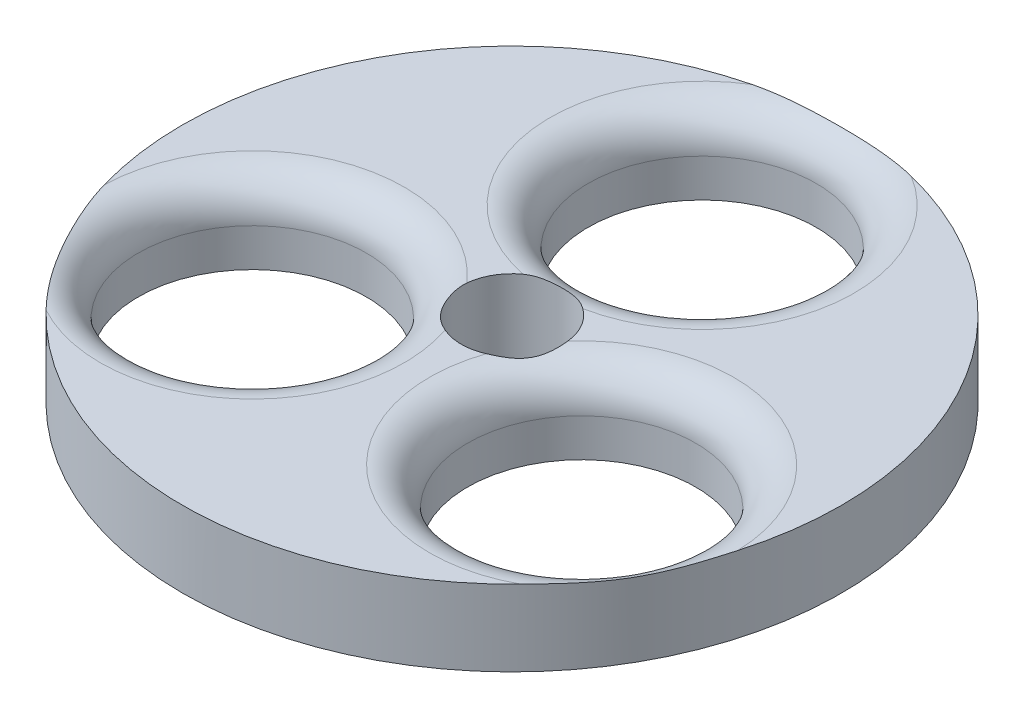
ISO-10303-21;
HEADER;
FILE_DESCRIPTION(('STEP AP214'),'2;1');
FILE_NAME('part.step','',(''),(''),'','','');
FILE_SCHEMA(('AUTOMOTIVE_DESIGN { 1 0 10303 214 1 1 1 1 }'));
ENDSEC;
DATA;
#1=APPLICATION_CONTEXT('core data for automotive mechanical design processes');
#2=APPLICATION_PROTOCOL_DEFINITION('international standard','automotive_design',2000,#1);
#3=PRODUCT_CONTEXT('',#1,'mechanical');
#4=PRODUCT('Part','Part','',(#3));
#5=PRODUCT_RELATED_PRODUCT_CATEGORY('part','',(#4));
#6=PRODUCT_DEFINITION_FORMATION('','',#4);
#7=PRODUCT_DEFINITION_CONTEXT('part definition',#1,'design');
#8=PRODUCT_DEFINITION('design','',#6,#7);
#9=PRODUCT_DEFINITION_SHAPE('','',#8);
#10=(LENGTH_UNIT() NAMED_UNIT(*) SI_UNIT(.MILLI.,.METRE.));
#11=(NAMED_UNIT(*) PLANE_ANGLE_UNIT() SI_UNIT($,.RADIAN.));
#12=(NAMED_UNIT(*) SI_UNIT($,.STERADIAN.) SOLID_ANGLE_UNIT());
#13=UNCERTAINTY_MEASURE_WITH_UNIT(LENGTH_MEASURE(1.E-05),#10,'distance_accuracy_value','');
#14=(GEOMETRIC_REPRESENTATION_CONTEXT(3) GLOBAL_UNCERTAINTY_ASSIGNED_CONTEXT((#13)) GLOBAL_UNIT_ASSIGNED_CONTEXT((#10,
#11,#12)) REPRESENTATION_CONTEXT('',''));
#15=CARTESIAN_POINT('',(0.,0.,0.));
#16=DIRECTION('',(0.,0.,1.));
#17=DIRECTION('',(1.,0.,0.));
#18=AXIS2_PLACEMENT_3D('',#15,#16,#17);
#19=CARTESIAN_POINT('',(2.23477578617358E-13,31.8657650719965,0.));
#20=DIRECTION('',(0.,1.,0.));
#21=DIRECTION('',(0.,0.,1.));
#22=AXIS2_PLACEMENT_3D('',#19,#20,#21);
#23=PLANE('',#22);
#24=CARTESIAN_POINT('',(2.23477578617358E-13,31.8657650719965,0.));
#25=DIRECTION('',(0.,1.,0.));
#26=DIRECTION('',(0.,0.,1.));
#27=AXIS2_PLACEMENT_3D('',#24,#25,#26);
#28=CIRCLE('',#27,145.6);
#29=CARTESIAN_POINT('',(-104.826758888139,31.8657650719965,101.048060946304));
#30=VERTEX_POINT('',#29);
#31=CARTESIAN_POINT('',(104.82675888814,31.8657650719965,101.048060946303));
#32=VERTEX_POINT('',#31);
#33=EDGE_CURVE('E107',#30,#32,#28,.T.);
#34=ORIENTED_EDGE('',*,*,#33,.T.);
#35=CARTESIAN_POINT('',(72.7461339178978,31.8657650719965,41.9999999999973));
#36=DIRECTION('',(0.,1.,0.));
#37=DIRECTION('',(0.,0.,1.));
#38=AXIS2_PLACEMENT_3D('',#35,#36,#37);
#39=CIRCLE('',#38,67.2);
#40=CARTESIAN_POINT('',(9.08711239235438,31.8657650719965,20.4739929756929));
#41=VERTEX_POINT('',#40);
#42=EDGE_CURVE('E95',#32,#41,#39,.F.);
#43=ORIENTED_EDGE('',*,*,#42,.T.);
#44=CARTESIAN_POINT('',(2.23477578617358E-13,31.8657650719965,0.));
#45=DIRECTION('',(0.,1.,0.));
#46=DIRECTION('',(0.,0.,1.));
#47=AXIS2_PLACEMENT_3D('',#44,#45,#46);
#48=CIRCLE('',#47,22.4);
#49=CARTESIAN_POINT('',(-9.08711239234495,31.8657650719965,20.4739929756969));
#50=VERTEX_POINT('',#49);
#51=EDGE_CURVE('E106',#50,#41,#48,.T.);
#52=ORIENTED_EDGE('',*,*,#51,.F.);
#53=CARTESIAN_POINT('',(-72.7461339178879,31.8657650719965,42.0000000000028));
#54=DIRECTION('',(0.,1.,0.));
#55=DIRECTION('',(0.,0.,1.));
#56=AXIS2_PLACEMENT_3D('',#53,#54,#55);
#57=CIRCLE('',#56,67.2);
#58=EDGE_CURVE('E136',#50,#30,#57,.F.);
#59=ORIENTED_EDGE('',*,*,#58,.T.);
#60=EDGE_LOOP('',(#34,#43,#52,#59));
#61=FACE_BOUND('',#60,.T.);
#62=ADVANCED_FACE('F35',(#61),#23,.T.);
#63=CARTESIAN_POINT('',(22.2745542300313,31.8657650719965,-2.36732630902591));
#64=VERTEX_POINT('',#63);
#65=CARTESIAN_POINT('',(13.1874418376814,31.8657650719965,-18.1066666666666));
#66=VERTEX_POINT('',#65);
#67=EDGE_CURVE('E117',#64,#66,#48,.T.);
#68=ORIENTED_EDGE('',*,*,#67,.F.);
#69=CARTESIAN_POINT('',(72.7461339178978,31.8657650719965,41.9999999999973));
#70=DIRECTION('',(0.,1.,0.));
#71=DIRECTION('',(0.,0.,1.));
#72=AXIS2_PLACEMENT_3D('',#69,#70,#71);
#73=CIRCLE('',#72,67.2);
#74=CARTESIAN_POINT('',(139.923567226732,31.8657650719965,40.2586057203474));
#75=VERTEX_POINT('',#74);
#76=EDGE_CURVE('E96',#64,#75,#73,.F.);
#77=ORIENTED_EDGE('',*,*,#76,.T.);
#78=CARTESIAN_POINT('',(35.096808338588,31.8657650719965,-141.306666666667));
#79=VERTEX_POINT('',#78);
#80=EDGE_CURVE('E129',#75,#79,#28,.T.);
#81=ORIENTED_EDGE('',*,*,#80,.T.);
#82=CARTESIAN_POINT('',(2.23477578617358E-13,31.8657650719965,-84.));
#83=DIRECTION('',(0.,1.,0.));
#84=DIRECTION('',(0.,0.,1.));
#85=AXIS2_PLACEMENT_3D('',#82,#83,#84);
#86=CIRCLE('',#85,67.2);
#87=EDGE_CURVE('E140',#79,#66,#86,.F.);
#88=ORIENTED_EDGE('',*,*,#87,.T.);
#89=EDGE_LOOP('',(#68,#77,#81,#88));
#90=FACE_BOUND('',#89,.T.);
#91=ADVANCED_FACE('F206',(#90),#23,.T.);
#92=CARTESIAN_POINT('',(-13.1874418376809,31.8657650719965,-18.1066666666666));
#93=VERTEX_POINT('',#92);
#94=CARTESIAN_POINT('',(-22.2745542300303,31.8657650719965,-2.36732630903062));
#95=VERTEX_POINT('',#94);
#96=EDGE_CURVE('E114',#93,#95,#48,.T.);
#97=ORIENTED_EDGE('',*,*,#96,.F.);
#98=CARTESIAN_POINT('',(2.23477578617358E-13,31.8657650719965,-84.));
#99=DIRECTION('',(0.,1.,0.));
#100=DIRECTION('',(0.,0.,1.));
#101=AXIS2_PLACEMENT_3D('',#98,#99,#100);
#102=CIRCLE('',#101,67.2);
#103=CARTESIAN_POINT('',(-35.0968083385875,31.8657650719965,-141.306666666667));
#104=VERTEX_POINT('',#103);
#105=EDGE_CURVE('E138',#93,#104,#102,.F.);
#106=ORIENTED_EDGE('',*,*,#105,.T.);
#107=CARTESIAN_POINT('',(-139.923567226722,31.8657650719965,40.2586057203783));
#108=VERTEX_POINT('',#107);
#109=EDGE_CURVE('E127',#104,#108,#28,.T.);
#110=ORIENTED_EDGE('',*,*,#109,.T.);
#111=CARTESIAN_POINT('',(-72.7461339178879,31.8657650719965,42.0000000000028));
#112=DIRECTION('',(0.,1.,0.));
#113=DIRECTION('',(0.,0.,1.));
#114=AXIS2_PLACEMENT_3D('',#111,#112,#113);
#115=CIRCLE('',#114,67.2);
#116=EDGE_CURVE('E134',#108,#95,#115,.F.);
#117=ORIENTED_EDGE('',*,*,#116,.T.);
#118=EDGE_LOOP('',(#97,#106,#110,#117));
#119=FACE_BOUND('',#118,.T.);
#120=ADVANCED_FACE('F161',(#119),#23,.T.);
#121=CARTESIAN_POINT('',(2.23477578617358E-13,-1.73423492800355,0.));
#122=DIRECTION('',(0.,1.,0.));
#123=DIRECTION('',(0.,0.,1.));
#124=AXIS2_PLACEMENT_3D('',#121,#122,#123);
#125=PLANE('',#124);
#126=CARTESIAN_POINT('',(2.23477578617358E-13,-1.73423492800355,0.));
#127=DIRECTION('',(0.,1.,0.));
#128=DIRECTION('',(0.,0.,1.));
#129=AXIS2_PLACEMENT_3D('',#126,#127,#128);
#130=CIRCLE('',#129,145.6);
#131=CARTESIAN_POINT('',(2.23477578617358E-13,-1.73423492800355,145.6));
#132=VERTEX_POINT('',#131);
#133=EDGE_CURVE('E122',#132,#132,#130,.T.);
#134=ORIENTED_EDGE('',*,*,#133,.F.);
#135=EDGE_LOOP('',(#134));
#136=FACE_BOUND('',#135,.T.);
#137=CARTESIAN_POINT('',(2.23477578617358E-13,-1.73423492800355,0.));
#138=DIRECTION('',(0.,1.,0.));
#139=DIRECTION('',(0.,0.,1.));
#140=AXIS2_PLACEMENT_3D('',#137,#138,#139);
#141=CIRCLE('',#140,22.4);
#142=CARTESIAN_POINT('',(2.23477578617358E-13,-1.73423492800355,22.4));
#143=VERTEX_POINT('',#142);
#144=EDGE_CURVE('E115',#143,#143,#141,.T.);
#145=ORIENTED_EDGE('',*,*,#144,.T.);
#146=EDGE_LOOP('',(#145));
#147=FACE_BOUND('',#146,.T.);
#148=CARTESIAN_POINT('',(2.23477578617358E-13,-1.73423492800355,-84.));
#149=DIRECTION('',(0.,1.,0.));
#150=DIRECTION('',(0.,0.,1.));
#151=AXIS2_PLACEMENT_3D('',#148,#149,#150);
#152=CIRCLE('',#151,50.4);
#153=CARTESIAN_POINT('',(2.23477578617358E-13,-1.73423492800355,-33.6));
#154=VERTEX_POINT('',#153);
#155=EDGE_CURVE('E119',#154,#154,#152,.T.);
#156=ORIENTED_EDGE('',*,*,#155,.T.);
#157=EDGE_LOOP('',(#156));
#158=FACE_BOUND('',#157,.T.);
#159=CARTESIAN_POINT('',(72.7461339178978,-1.73423492800355,41.9999999999973));
#160=DIRECTION('',(0.,1.,0.));
#161=DIRECTION('',(0.,0.,1.));
#162=AXIS2_PLACEMENT_3D('',#159,#160,#161);
#163=CIRCLE('',#162,50.4);
#164=CARTESIAN_POINT('',(72.7461339178978,-1.73423492800355,92.3999999999973));
#165=VERTEX_POINT('',#164);
#166=EDGE_CURVE('E235',#165,#165,#163,.T.);
#167=ORIENTED_EDGE('',*,*,#166,.T.);
#168=EDGE_LOOP('',(#167));
#169=FACE_BOUND('',#168,.T.);
#170=CARTESIAN_POINT('',(-72.7461339178879,-1.73423492800355,42.0000000000028));
#171=DIRECTION('',(0.,1.,0.));
#172=DIRECTION('',(0.,0.,1.));
#173=AXIS2_PLACEMENT_3D('',#170,#171,#172);
#174=CIRCLE('',#173,50.4);
#175=CARTESIAN_POINT('',(-72.7461339178879,-1.73423492800355,92.4000000000028));
#176=VERTEX_POINT('',#175);
#177=EDGE_CURVE('E233',#176,#176,#174,.T.);
#178=ORIENTED_EDGE('',*,*,#177,.T.);
#179=EDGE_LOOP('',(#178));
#180=FACE_BOUND('',#179,.T.);
#181=ADVANCED_FACE('F212',(#136,#147,#158,#169,#180),#125,.F.);
#182=CARTESIAN_POINT('',(2.23477578617358E-13,31.8657650719965,0.));
#183=DIRECTION('',(0.,-1.,0.));
#184=DIRECTION('',(0.,0.,-1.));
#185=AXIS2_PLACEMENT_3D('',#182,#183,#184);
#186=CYLINDRICAL_SURFACE('',#185,145.6);
#187=ORIENTED_EDGE('',*,*,#80,.F.);
#188=CARTESIAN_POINT('',(139.923567226732,31.8657650719965,40.2586057203474));
#189=CARTESIAN_POINT('',(139.726695505825,31.8657601859447,40.9428583914413));
#190=CARTESIAN_POINT('',(139.52481043307,31.8616562214105,41.6256431473033));
#191=CARTESIAN_POINT('',(139.111076116014,31.8464291109142,42.9880834401035));
#192=CARTESIAN_POINT('',(138.899227233044,31.8353062193078,43.6677390895371));
#193=CARTESIAN_POINT('',(138.248887676413,31.7931822231437,45.7015433460936));
#194=CARTESIAN_POINT('',(137.795530535242,31.7534249146378,47.0507849078582));
#195=CARTESIAN_POINT('',(136.849455165038,31.659533100797,49.7354322419516));
#196=CARTESIAN_POINT('',(136.356721266702,31.6053928518993,51.0708322650786));
#197=CARTESIAN_POINT('',(135.332383501371,31.4912359687793,53.7264499054257));
#198=CARTESIAN_POINT('',(134.800777958949,31.4312190812273,55.0466668653915));
#199=CARTESIAN_POINT('',(133.707318929033,31.3140531265344,57.6513471427394));
#200=CARTESIAN_POINT('',(133.146038581411,31.2568745502908,58.936049731815));
#201=CARTESIAN_POINT('',(131.986479474581,31.1510690638781,61.4889803461969));
#202=CARTESIAN_POINT('',(131.388201471384,31.1024419790452,62.7572087074985));
#203=CARTESIAN_POINT('',(130.155270632683,31.0191732762235,65.2758034421895));
#204=CARTESIAN_POINT('',(129.520631032171,30.9845266060743,66.5261761103159));
#205=CARTESIAN_POINT('',(128.541680034918,30.9458247189867,68.3877777355784));
#206=CARTESIAN_POINT('',(128.210856458572,30.9351353490336,69.0059995435565));
#207=CARTESIAN_POINT('',(127.540286644548,30.9184470183222,70.2376459180874));
#208=CARTESIAN_POINT('',(127.200540516285,30.9124480000749,70.8510705433472));
#209=CARTESIAN_POINT('',(126.481216185113,30.9049910504233,72.1279849332048));
#210=CARTESIAN_POINT('',(126.100806089659,30.9039906856191,72.7910088482497));
#211=CARTESIAN_POINT('',(125.329597719712,30.9077993533471,74.1109722148275));
#212=CARTESIAN_POINT('',(124.938799418886,30.9126084006063,74.7679116509318));
#213=CARTESIAN_POINT('',(124.146933137204,30.927880063474,76.0755099391277));
#214=CARTESIAN_POINT('',(123.745865097307,30.9383427115916,76.7261687550826));
#215=CARTESIAN_POINT('',(122.933583040057,30.9645809368847,78.0210117253559));
#216=CARTESIAN_POINT('',(122.522369027075,30.9803565117713,78.6651958824634));
#217=CARTESIAN_POINT('',(121.689716465727,31.0167168222463,79.9472163032733));
#218=CARTESIAN_POINT('',(121.268273204262,31.0373038138773,80.585049442294));
#219=CARTESIAN_POINT('',(120.415460718699,31.0826015905468,81.8539014194271));
#220=CARTESIAN_POINT('',(119.984091335919,31.1073124415495,82.4849201483659));
#221=CARTESIAN_POINT('',(118.675252983152,31.1864402212362,84.3675336799653));
#222=CARTESIAN_POINT('',(117.783036152609,31.24585321209,85.6087130109993));
#223=CARTESIAN_POINT('',(115.945052612754,31.3710915755441,88.0824530552424));
#224=CARTESIAN_POINT('',(114.99864411835,31.4370067839661,89.3145313440252));
#225=CARTESIAN_POINT('',(113.066780928266,31.5645056922724,91.747894074205));
#226=CARTESIAN_POINT('',(112.08132803443,31.626089591677,92.9491799324244));
#227=CARTESIAN_POINT('',(110.574767644992,31.7070237154793,94.7268899558167));
#228=CARTESIAN_POINT('',(110.068000520052,31.7320892362389,95.3152577409454));
#229=CARTESIAN_POINT('',(109.045016108565,31.7769782942471,96.4839235500814));
#230=CARTESIAN_POINT('',(108.528798937054,31.7968018952608,97.0642216721707));
#231=CARTESIAN_POINT('',(107.486951540798,31.8297455414591,98.2166927703376));
#232=CARTESIAN_POINT('',(106.961319656504,31.8428643925058,98.7888642814093));
#233=CARTESIAN_POINT('',(105.900876443719,31.8608702103693,99.9248128306613));
#234=CARTESIAN_POINT('',(105.366064701519,31.8657568051943,100.488589488362));
#235=CARTESIAN_POINT('',(104.82675888814,31.8657650719965,101.048060946303));
#236=B_SPLINE_CURVE_WITH_KNOTS('',3,(#188,#189,#190,#191,#192,#193,#194,#195,#196,#197,#198,
#199,#200,#201,#202,#203,#204,#205,#206,#207,#208,#209,#210,#211,#212,#213,#214,#215,#216,#217,
#218,#219,#220,#221,#222,#223,#224,#225,#226,#227,#228,#229,#230,#231,#232,#233,#234,#235),
.UNSPECIFIED.,.F.,.F.,(4,2,2,2,2,2,2,2,2,2,2,2,2,2,2,2,2,2,2,2,2,2,2,4),(0.,2.13596160512915,
4.27184581053873,8.54281658862121,12.8154954707875,17.0883586204998,21.2971464485245,
25.5058483022956,29.7130278749878,31.8167151477063,33.9203766354711,36.2134712220517,
38.5065716217107,40.7996852072851,43.0927978049595,45.3869877933668,47.6812144826078,
52.2695706332284,56.9338478453245,61.5979100578937,63.9286007249599,66.2592630390314,
68.5903403071286,70.9215229070047),.UNSPECIFIED.);
#237=EDGE_CURVE('E185',#75,#32,#236,.T.);
#238=ORIENTED_EDGE('',*,*,#237,.T.);
#239=ORIENTED_EDGE('',*,*,#33,.F.);
#240=CARTESIAN_POINT('',(-104.826758888139,31.8657650719965,101.048060946304));
#241=CARTESIAN_POINT('',(-105.32090322346,31.8657601859447,100.535438699165));
#242=CARTESIAN_POINT('',(-105.811269630976,31.8616562214105,100.019208719584));
#243=CARTESIAN_POINT('',(-106.784310377152,31.8464291109142,98.9796841441952));
#244=CARTESIAN_POINT('',(-107.266984993902,31.8353062193079,98.4563898050628));
#245=CARTESIAN_POINT('',(-108.703141368089,31.7931822231438,96.8762770996563));
#246=CARTESIAN_POINT('',(-109.644940265834,31.7534249146379,95.8090375175331));
#247=CARTESIAN_POINT('',(-111.496875372259,31.6595331007972,93.6473885459949));
#248=CARTESIAN_POINT('',(-112.406998767333,31.6053928518996,92.5529684611665));
#249=CARTESIAN_POINT('',(-114.194662223945,31.4912359687798,90.3380571141598));
#250=CARTESIAN_POINT('',(-115.072200878572,31.4312190812279,89.2175647296469));
#251=CARTESIAN_POINT('',(-116.781190652533,31.3140531265352,86.9682612930678));
#252=CARTESIAN_POINT('',(-117.613135557169,31.2568745502917,85.839826958845));
#253=CARTESIAN_POINT('',(-119.244258769908,31.1510690638792,83.5591540079491));
#254=CARTESIAN_POINT('',(-120.043437746996,31.1024419790464,82.4069158780044));
#255=CARTESIAN_POINT('',(-121.608139349726,31.0191732762249,80.0798690832344));
#256=CARTESIAN_POINT('',(-122.373674044265,30.9845266060758,78.9050687328797));
#257=CARTESIAN_POINT('',(-123.496392844842,30.9458247189884,77.1264714875673));
#258=CARTESIAN_POINT('',(-123.866376847551,30.9351353490353,76.5308589622922));
#259=CARTESIAN_POINT('',(-124.597728989362,30.9184470183239,75.3343052810708));
#260=CARTESIAN_POINT('',(-124.959097234012,30.9124480000767,74.7333641905271));
#261=CARTESIAN_POINT('',(-125.7052753685,30.9049910504252,73.4719538512439));
#262=CARTESIAN_POINT('',(-126.089265874519,30.903990685621,72.8109970872031));
#263=CARTESIAN_POINT('',(-126.846783497065,30.9077993533491,71.4831293639295));
#264=CARTESIAN_POINT('',(-127.220310587066,30.9126084006084,70.8162183896068));
#265=CARTESIAN_POINT('',(-127.956790781747,30.927880063476,69.4766429291729));
#266=CARTESIAN_POINT('',(-128.319743825612,30.9383427115937,68.8039784099995));
#267=CARTESIAN_POINT('',(-129.034969703154,30.9645809368868,67.4531000282473));
#268=CARTESIAN_POINT('',(-129.387242541434,30.9803565117733,66.7748861680594));
#269=CARTESIAN_POINT('',(-130.08117851335,31.0167168222483,65.4127776870014));
#270=CARTESIAN_POINT('',(-130.422836584385,31.0373038138793,64.7288805468097));
#271=CARTESIAN_POINT('',(-131.095288387442,31.0826015905487,63.3558972810818));
#272=CARTESIAN_POINT('',(-131.426081945577,31.1073124415513,62.6668110727108));
#273=CARTESIAN_POINT('',(-132.402053913066,31.1864402212379,60.592017043969));
#274=CARTESIAN_POINT('',(-133.030838329122,31.2458532120916,59.198744937519));
#275=CARTESIAN_POINT('',(-134.254168279866,31.3710915755453,56.3701344781478));
#276=CARTESIAN_POINT('',(-134.847975130201,31.4370067839672,54.934481535246));
#277=CARTESIAN_POINT('',(-135.989397476116,31.5645056922731,52.0447575709102));
#278=CARTESIAN_POINT('',(-136.537015099623,31.6260895916777,50.5906874015066));
#279=CARTESIAN_POINT('',(-137.323276945723,31.7070237154797,48.397112820224));
#280=CARTESIAN_POINT('',(-137.579434831943,31.7320892362393,47.6640557236597));
#281=CARTESIAN_POINT('',(-138.080036905445,31.7769782942473,46.1937923310693));
#282=CARTESIAN_POINT('',(-138.324481235187,31.796801895261,45.4565860856271));
#283=CARTESIAN_POINT('',(-138.801626785199,31.8297455414592,43.9780842245204));
#284=CARTESIAN_POINT('',(-139.034325906961,31.8428643925059,43.2367879041478));
#285=CARTESIAN_POINT('',(-139.487864601613,31.8608702103693,41.7504428679802));
#286=CARTESIAN_POINT('',(-139.708703638142,31.8657568051943,41.0053939841433));
#287=CARTESIAN_POINT('',(-139.923567226722,31.8657650719965,40.2586057203783));
#288=B_SPLINE_CURVE_WITH_KNOTS('',3,(#240,#241,#242,#243,#244,#245,#246,#247,#248,#249,#250,
#251,#252,#253,#254,#255,#256,#257,#258,#259,#260,#261,#262,#263,#264,#265,#266,#267,#268,#269,
#270,#271,#272,#273,#274,#275,#276,#277,#278,#279,#280,#281,#282,#283,#284,#285,#286,#287),
.UNSPECIFIED.,.F.,.F.,(4,2,2,2,2,2,2,2,2,2,2,2,2,2,2,2,2,2,2,2,2,2,2,4),(0.,2.13596160512916,
4.27184581053872,8.54281658862116,12.8154954707874,17.0883586204997,21.2971464485245,
25.5058483022955,29.7130278749877,31.8167151477062,33.9203766354711,36.2134712220497,
38.5065716217069,40.7996852072793,43.0927978049518,45.3869877933572,47.6812144825963,
52.269570633213,56.9338478453051,61.5979100578703,63.9286007249345,66.2592630390041,
68.5903403070993,70.9215229069734),.UNSPECIFIED.);
#289=EDGE_CURVE('E51',#30,#108,#288,.T.);
#290=ORIENTED_EDGE('',*,*,#289,.T.);
#291=ORIENTED_EDGE('',*,*,#109,.F.);
#292=CARTESIAN_POINT('',(-35.0968083385875,31.8657650719965,-141.306666666667));
#293=CARTESIAN_POINT('',(-34.4057922823595,31.8657601859447,-141.478297090622));
#294=CARTESIAN_POINT('',(-33.7135408020889,31.8616562214105,-141.644851866902));
#295=CARTESIAN_POINT('',(-32.3267657388562,31.8464291109142,-141.967767584314));
#296=CARTESIAN_POINT('',(-31.6322422391359,31.8353062193078,-142.124128894615));
#297=CARTESIAN_POINT('',(-29.5457463083177,31.7931822231438,-142.577820445765));
#298=CARTESIAN_POINT('',(-28.1505902694024,31.7534249146378,-142.859822425406));
#299=CARTESIAN_POINT('',(-25.3525797927734,31.6595331007971,-143.382820787961));
#300=CARTESIAN_POINT('',(-23.949722499363,31.6053928518994,-143.62380072626));
#301=CARTESIAN_POINT('',(-21.1377212774184,31.4912359687796,-144.0645070196));
#302=CARTESIAN_POINT('',(-19.7285770803701,31.4312190812276,-144.264231595053));
#303=CARTESIAN_POINT('',(-16.9261282764923,31.3140531265348,-144.619608435822));
#304=CARTESIAN_POINT('',(-15.5329030242347,31.2568745502913,-144.775876690674));
#305=CARTESIAN_POINT('',(-12.7422207046656,31.1510690638786,-145.04813435416));
#306=CARTESIAN_POINT('',(-11.3447637243802,31.1024419790458,-145.164124585517));
#307=CARTESIAN_POINT('',(-8.54713128294949,31.0191732762242,-145.355672525438));
#308=CARTESIAN_POINT('',(-7.14695698789802,30.984526606075,-145.43124484321));
#309=CARTESIAN_POINT('',(-5.04528719006788,30.9458247189875,-145.514249223159));
#310=CARTESIAN_POINT('',(-4.34447961101261,30.9351353490345,-145.536858505862));
#311=CARTESIAN_POINT('',(-2.94255765517781,30.9184470183231,-145.571951199172));
#312=CARTESIAN_POINT('',(-2.24144328226398,30.9124480000758,-145.584434733888));
#313=CARTESIAN_POINT('',(-0.77594081660388,30.9049910504243,-145.599938784462));
#314=CARTESIAN_POINT('',(-0.0115402151319072,30.9039906856201,-145.602005935465));
#315=CARTESIAN_POINT('',(1.5171857773624,30.9077993533481,-145.594101578768));
#316=CARTESIAN_POINT('',(2.28151116818916,30.9126084006074,-145.584130040549));
#317=CARTESIAN_POINT('',(3.80985764455228,30.927880063475,-145.55215286831));
#318=CARTESIAN_POINT('',(4.57387872831355,30.9383427115927,-145.530147165091));
#319=CARTESIAN_POINT('',(6.10138666310614,30.9645809368858,-145.474111753611));
#320=CARTESIAN_POINT('',(6.86487351436749,30.9803565117723,-145.44008205053));
#321=CARTESIAN_POINT('',(8.39146204763302,31.0167168222473,-145.35999399028));
#322=CARTESIAN_POINT('',(9.15456338013238,31.0373038138783,-145.313929989109));
#323=CARTESIAN_POINT('',(10.6798276687528,31.0826015905477,-145.209798700513));
#324=CARTESIAN_POINT('',(11.4419906096672,31.1073124415504,-145.15173122108));
#325=CARTESIAN_POINT('',(13.7268009299232,31.186440221237,-144.959550723936));
#326=CARTESIAN_POINT('',(15.2478021765217,31.2458532120908,-144.807457948519));
#327=CARTESIAN_POINT('',(18.3091156671212,31.3710915755447,-144.452587533388));
#328=CARTESIAN_POINT('',(19.8493310118599,31.4370067839667,-144.249012879268));
#329=CARTESIAN_POINT('',(22.9226165478583,31.5645056922728,-143.79265164511));
#330=CARTESIAN_POINT('',(24.4556870652009,31.6260895916774,-143.539867333924));
#331=CARTESIAN_POINT('',(26.7485093007387,31.7070237154795,-143.124002776032));
#332=CARTESIAN_POINT('',(27.5114343118981,31.7320892362391,-142.979313464596));
#333=CARTESIAN_POINT('',(29.0350207968872,31.7769782942472,-142.67771588114));
#334=CARTESIAN_POINT('',(29.79568229814,31.7968018952609,-142.520807757787));
#335=CARTESIAN_POINT('',(31.3146752444074,31.8297455414592,-142.194776994846));
#336=CARTESIAN_POINT('',(32.0730062504637,31.8428643925059,-142.025652185544));
#337=CARTESIAN_POINT('',(33.5869881579001,31.8608702103693,-141.675255698628));
#338=CARTESIAN_POINT('',(34.342638936629,31.8657568051943,-141.49398347249));
#339=CARTESIAN_POINT('',(35.096808338588,31.8657650719965,-141.306666666667));
#340=B_SPLINE_CURVE_WITH_KNOTS('',3,(#292,#293,#294,#295,#296,#297,#298,#299,#300,#301,#302,
#303,#304,#305,#306,#307,#308,#309,#310,#311,#312,#313,#314,#315,#316,#317,#318,#319,#320,#321,
#322,#323,#324,#325,#326,#327,#328,#329,#330,#331,#332,#333,#334,#335,#336,#337,#338,#339),
.UNSPECIFIED.,.F.,.F.,(4,2,2,2,2,2,2,2,2,2,2,2,2,2,2,2,2,2,2,2,2,2,2,4),(0.,2.13596160512915,
4.27184581053872,8.54281658862119,12.8154954707875,17.0883586204997,21.2971464485245,
25.5058483022955,29.7130278749878,31.8167151477062,33.9203766354711,36.2134712220507,
38.5065716217088,40.7996852072822,43.0927978049557,45.386987793362,47.6812144826021,
52.2695706332207,56.9338478453149,61.5979100578821,63.9286007249473,66.2592630390178,
68.5903403071141,70.9215229069891),.UNSPECIFIED.);
#341=EDGE_CURVE('E190',#104,#79,#340,.T.);
#342=ORIENTED_EDGE('',*,*,#341,.T.);
#343=EDGE_LOOP('',(#187,#238,#239,#290,#291,#342));
#344=FACE_BOUND('',#343,.T.);
#345=ORIENTED_EDGE('',*,*,#133,.T.);
#346=EDGE_LOOP('',(#345));
#347=FACE_BOUND('',#346,.T.);
#348=ADVANCED_FACE('F159',(#344,#347),#186,.T.);
#349=CARTESIAN_POINT('',(2.23477578617358E-13,31.8657650719965,0.));
#350=DIRECTION('',(0.,-1.,0.));
#351=DIRECTION('',(0.,0.,-1.));
#352=AXIS2_PLACEMENT_3D('',#349,#350,#351);
#353=CYLINDRICAL_SURFACE('',#352,22.4);
#354=ORIENTED_EDGE('',*,*,#51,.T.);
#355=CARTESIAN_POINT('',(9.08711239235438,31.8657650719965,20.4739929756929));
#356=CARTESIAN_POINT('',(9.41621093669795,31.8657716118947,20.3279416072496));
#357=CARTESIAN_POINT('',(9.74170829624843,31.8594969254864,20.1739621432215));
#358=CARTESIAN_POINT('',(10.3845010113663,31.8364976557753,19.8507264758442));
#359=CARTESIAN_POINT('',(10.7017995285294,31.8197771650964,19.6814762777161));
#360=CARTESIAN_POINT('',(11.3270935608473,31.778019616361,19.3283669587393));
#361=CARTESIAN_POINT('',(11.635099373914,31.7529921630728,19.1445248953802));
#362=CARTESIAN_POINT('',(12.2415303198177,31.6967253868685,18.7625529988077));
#363=CARTESIAN_POINT('',(12.5399544885276,31.6654854410981,18.564421734253));
#364=CARTESIAN_POINT('',(13.421323834378,31.5654378912301,17.9483303262399));
#365=CARTESIAN_POINT('',(13.9890881081722,31.490404614977,17.5093948560165));
#366=CARTESIAN_POINT('',(15.0799062168242,31.3400783323187,16.5792186241223));
#367=CARTESIAN_POINT('',(15.6029551597803,31.2647852984308,16.0879721527441));
#368=CARTESIAN_POINT('',(16.5232523253366,31.1391870834935,15.1363650090299));
#369=CARTESIAN_POINT('',(16.9274381320312,31.0868179161159,14.6830034359074));
#370=CARTESIAN_POINT('',(17.5055366818257,31.0213912994684,13.9788584079995));
#371=CARTESIAN_POINT('',(17.6935368473353,31.0017704825366,13.7401301197391));
#372=CARTESIAN_POINT('',(18.0598463383313,30.9675654332502,13.2549729691289));
#373=CARTESIAN_POINT('',(18.2381556157671,30.9529812258667,13.0085440686067));
#374=CARTESIAN_POINT('',(18.584137069806,30.9294181991681,12.5092685789207));
#375=CARTESIAN_POINT('',(18.7518422083843,30.9204211565492,12.2564456829857));
#376=CARTESIAN_POINT('',(19.0769050081281,30.9082767827968,11.7440935615657));
#377=CARTESIAN_POINT('',(19.2342626868977,30.9051294417112,11.4845643474911));
#378=CARTESIAN_POINT('',(19.5383062337709,30.9047983244864,10.9593189905607));
#379=CARTESIAN_POINT('',(19.6849919222224,30.9076146487158,10.6936027436517));
#380=CARTESIAN_POINT('',(19.9673957583734,30.9191092199768,10.1565327769569));
#381=CARTESIAN_POINT('',(20.1031139713611,30.9277874321104,9.88517909074236));
#382=CARTESIAN_POINT('',(20.3582344286968,30.9502477317361,9.34811047136148));
#383=CARTESIAN_POINT('',(20.4780676423252,30.9638164799368,9.08259128846964));
#384=CARTESIAN_POINT('',(20.707202358326,30.9956274099276,8.5473132767824));
#385=CARTESIAN_POINT('',(20.8165028516681,31.0138700388623,8.27755404466555));
#386=CARTESIAN_POINT('',(21.1283548325059,31.0747564537732,7.46262752000441));
#387=CARTESIAN_POINT('',(21.3149097991857,31.1235638737466,6.91169978163169));
#388=CARTESIAN_POINT('',(21.6447123462628,31.2315373109234,5.79699280224121));
#389=CARTESIAN_POINT('',(21.7878754390869,31.2907231867897,5.23319075897396));
#390=CARTESIAN_POINT('',(22.0299037635905,31.4117680795058,4.09645155804543));
#391=CARTESIAN_POINT('',(22.1287730044699,31.4736268538657,3.52351523202516));
#392=CARTESIAN_POINT('',(22.2635772011348,31.5775969582438,2.50792248821882));
#393=CARTESIAN_POINT('',(22.3088786719717,31.62091121124,2.06661045742862));
#394=CARTESIAN_POINT('',(22.3732154853015,31.7002705556989,1.18153697569167));
#395=CARTESIAN_POINT('',(22.392259589018,31.7363180684055,0.73777639139093));
#396=CARTESIAN_POINT('',(22.4038831385291,31.7970943100938,-0.149900266402827));
#397=CARTESIAN_POINT('',(22.396522630467,31.8218485763569,-0.593813694560361));
#398=CARTESIAN_POINT('',(22.3553905384795,31.8561960958408,-1.48134133951209));
#399=CARTESIAN_POINT('',(22.3215975004841,31.8657770144371,-1.92495502014754));
#400=CARTESIAN_POINT('',(22.2745542300313,31.8657650719965,-2.36732630902591));
#401=B_SPLINE_CURVE_WITH_KNOTS('',3,(#355,#356,#357,#358,#359,#360,#361,#362,#363,#364,#365,
#366,#367,#368,#369,#370,#371,#372,#373,#374,#375,#376,#377,#378,#379,#380,#381,#382,#383,#384,
#385,#386,#387,#388,#389,#390,#391,#392,#393,#394,#395,#396,#397,#398,#399,#400),.UNSPECIFIED.,
.F.,.F.,(4,2,2,2,2,2,2,2,2,2,2,2,2,2,2,2,2,2,2,2,2,2,4),(0.,1.07988343339238,2.15934403794276,
3.2375608593354,4.31588583552209,6.47693014607937,8.63821057528604,10.4647739434217,
11.3780277151556,12.2912860146803,13.2015497330356,14.1118119027342,15.0220893922467,
15.932361462581,16.8069615550803,17.6816453507914,19.4306431263647,21.1830247866722,
22.9352478003872,24.2717050932164,25.6077163460058,26.9406913330809,28.2747493587986),.UNSPECIFIED.);
#402=EDGE_CURVE('E90',#41,#64,#401,.T.);
#403=ORIENTED_EDGE('',*,*,#402,.T.);
#404=ORIENTED_EDGE('',*,*,#67,.T.);
#405=CARTESIAN_POINT('',(13.1874418376814,31.8657650719965,-18.1066666666666));
#406=CARTESIAN_POINT('',(12.8964083701802,31.8657716118947,-18.3186486821951));
#407=CARTESIAN_POINT('',(12.6003095628956,31.8594969254864,-18.5235479324165));
#408=CARTESIAN_POINT('',(11.9989829059788,31.8364976557753,-18.9186049193877));
#409=CARTESIAN_POINT('',(11.6937586762227,31.8197771650963,-19.1087683967701));
#410=CARTESIAN_POINT('',(11.075310019517,31.7780196163609,-19.4737342541039));
#411=CARTESIAN_POINT('',(10.7620952158305,31.7529921630727,-19.6485540810535));
#412=CARTESIAN_POINT('',(10.1280823769153,31.6967253868684,-19.9827527375611));
#413=CARTESIAN_POINT('',(9.80728358417204,31.665485441098,-20.1421300164898));
#414=CARTESIAN_POINT('',(8.8330481008543,31.56543789123,-20.5973725561067));
#415=CARTESIAN_POINT('',(8.16903669612166,31.4904046149768,-20.8696031054622));
#416=CARTESIAN_POINT('',(6.81807139497895,31.3400783323184,-21.3491911825161));
#417=CARTESIAN_POINT('',(6.13111499976795,31.2647852984304,-21.5565416188498));
#418=CARTESIAN_POINT('',(4.84685045611071,31.139187083493,-21.8777387713955));
#419=CARTESIAN_POINT('',(4.25213491333968,31.0868179161153,-22.001093161281));
#420=CARTESIAN_POINT('',(3.35327815632577,31.0213912994678,-22.1496686773402));
#421=CARTESIAN_POINT('',(3.05253331133544,31.001770482536,-22.1931174524571));
#422=CARTESIAN_POINT('',(2.44922014858147,30.9675654332494,-22.267772202002));
#423=CARTESIAN_POINT('',(2.14665182178468,30.9529812258659,-22.2989781157309));
#424=CARTESIAN_POINT('',(1.54127583721032,30.9294181991673,-22.3489690993239));
#425=CARTESIAN_POINT('',(1.23847221738311,30.9204211565483,-22.3677945617105));
#426=CARTESIAN_POINT('',(0.632230864678647,30.9082767827959,-22.3931311434041));
#427=CARTESIAN_POINT('',(0.328793132881101,30.9051294417102,-22.3996422836618));
#428=CARTESIAN_POINT('',(-0.278104462877082,30.9047983244855,-22.4003290406457));
#429=CARTESIAN_POINT('',(-0.581564327124255,30.9076146487147,-22.3945044497618));
#430=CARTESIAN_POINT('',(-1.18788247996702,30.9191092199757,-22.3705383626475));
#431=CARTESIAN_POINT('',(-1.49074077213323,30.9277874321093,-22.3523969397439));
#432=CARTESIAN_POINT('',(-2.08341606876037,30.950247731735,-22.3048034271315));
#433=CARTESIAN_POINT('',(-2.37327903315099,30.9638164799356,-22.2758224429049));
#434=CARTESIAN_POINT('',(-2.95141074735976,30.9956274099264,-22.2066199220071));
#435=CARTESIAN_POINT('',(-3.23967934194936,31.0138700388611,-22.1663973098291));
#436=CARTESIAN_POINT('',(-4.10135240494258,31.074756453772,-22.0290057851248));
#437=CARTESIAN_POINT('',(-4.67174730536279,31.1235638737454,-21.9151032562855));
#438=CARTESIAN_POINT('',(-5.80201314082931,31.2315373109223,-21.6433671505921));
#439=CARTESIAN_POINT('',(-6.36186157941642,31.2907231867886,-21.4854490042287));
#440=CARTESIAN_POINT('',(-7.46732076714997,31.4117680795047,-21.1266820812202));
#441=CARTESIAN_POINT('',(-8.01293280067418,31.4736268538647,-20.9258371924646));
#442=CARTESIAN_POINT('',(-8.95986401504276,31.5775969582429,-20.53478467941));
#443=CARTESIAN_POINT('',(-9.36470218012185,31.6209112112392,-20.3533608885883));
#444=CARTESIAN_POINT('',(-10.1633667061881,31.7002705556983,-19.9665414624615));
#445=CARTESIAN_POINT('',(-10.5571966972497,31.7363180684051,-19.7611538479216));
#446=CARTESIAN_POINT('',(-11.3317590080023,31.7970943100936,-19.327381808183));
#447=CARTESIAN_POINT('',(-11.7125190598373,31.8218485763568,-19.0990507071373));
#448=CARTESIAN_POINT('',(-12.4605745009339,31.8561960958408,-18.6196654480887));
#449=CARTESIAN_POINT('',(-12.8278586988333,31.8657770144371,-18.3685929783955));
#450=CARTESIAN_POINT('',(-13.1874418376809,31.8657650719965,-18.1066666666666));
#451=B_SPLINE_CURVE_WITH_KNOTS('',3,(#405,#406,#407,#408,#409,#410,#411,#412,#413,#414,#415,
#416,#417,#418,#419,#420,#421,#422,#423,#424,#425,#426,#427,#428,#429,#430,#431,#432,#433,#434,
#435,#436,#437,#438,#439,#440,#441,#442,#443,#444,#445,#446,#447,#448,#449,#450),.UNSPECIFIED.,
.F.,.F.,(4,2,2,2,2,2,2,2,2,2,2,2,2,2,2,2,2,2,2,2,2,2,4),(0.,1.07988343339239,2.15934403794277,
3.23756085933541,4.3158858355221,6.4769301460794,8.63821057528609,10.4647739434217,
11.3780277151555,12.2912860146802,13.2015497330354,14.111811902734,15.0220893922464,
15.9323614625807,16.80696155508,17.681645350791,19.4306431263642,21.1830247866716,
22.9352478003866,24.2717050932178,25.6077163460092,26.9406913330863,28.274749358806),.UNSPECIFIED.);
#452=EDGE_CURVE('E101',#66,#93,#451,.T.);
#453=ORIENTED_EDGE('',*,*,#452,.T.);
#454=ORIENTED_EDGE('',*,*,#96,.T.);
#455=CARTESIAN_POINT('',(-22.2745542300303,31.8657650719965,-2.36732630903062));
#456=CARTESIAN_POINT('',(-22.3126193068728,31.8657716118947,-2.00929292505897));
#457=CARTESIAN_POINT('',(-22.3420178591387,31.8594969254864,-1.65041421080944));
#458=CARTESIAN_POINT('',(-22.3834839173399,31.8364976557753,-0.932121556461182));
#459=CARTESIAN_POINT('',(-22.3955582047471,31.8197771650963,-0.572707880950692));
#460=CARTESIAN_POINT('',(-22.4024035803594,31.7780196163609,0.145367295359736));
#461=CARTESIAN_POINT('',(-22.3971945897397,31.7529921630727,0.504029185668399));
#462=CARTESIAN_POINT('',(-22.3696126967283,31.6967253868683,1.22019973874828));
#463=CARTESIAN_POINT('',(-22.3472380726951,31.6654854410979,1.57770828223165));
#464=CARTESIAN_POINT('',(-22.2543719352279,31.5654378912298,2.64904222986151));
#465=CARTESIAN_POINT('',(-22.1581248042897,31.4904046149766,3.3602082494403));
#466=CARTESIAN_POINT('',(-21.8979776117993,31.3400783323181,4.76997255838815));
#467=CARTESIAN_POINT('',(-21.7340701595447,31.26478529843,5.46856946609993));
#468=CARTESIAN_POINT('',(-21.370102781444,31.1391870834925,6.74137376235959));
#469=CARTESIAN_POINT('',(-21.1795730453677,31.0868179161148,7.3180897253675));
#470=CARTESIAN_POINT('',(-20.8588148381486,31.0213912994671,8.17081026933444));
#471=CARTESIAN_POINT('',(-20.7460701586679,31.0017704825353,8.4529873327117));
#472=CARTESIAN_POINT('',(-20.5090664869101,30.9675654332487,9.01279923286664));
#473=CARTESIAN_POINT('',(-20.3848074375492,30.9529812258652,9.29043404711763));
#474=CARTESIAN_POINT('',(-20.1254129070139,30.9294181991665,9.83970052039656));
#475=CARTESIAN_POINT('',(-19.9903144257651,30.9204211565475,10.1113488787181));
#476=CARTESIAN_POINT('',(-19.7091358728046,30.908276782795,10.6490375818316));
#477=CARTESIAN_POINT('',(-19.5630558197767,30.9051294417093,10.9150779361639));
#478=CARTESIAN_POINT('',(-19.260201770892,30.9047983244845,11.4410100500781));
#479=CARTESIAN_POINT('',(-19.1034275950963,30.9076146487137,11.7009017061032));
#480=CARTESIAN_POINT('',(-18.7795132784048,30.9191092199746,12.2140055856836));
#481=CARTESIAN_POINT('',(-18.6123731992263,30.9277874321082,12.4672178489945));
#482=CARTESIAN_POINT('',(-18.2748183599351,30.9502477317339,12.9566929557629));
#483=CARTESIAN_POINT('',(-18.104788609173,30.9638164799345,13.1932311544281));
#484=CARTESIAN_POINT('',(-17.7557916109652,30.9956274099252,13.6593066452175));
#485=CARTESIAN_POINT('',(-17.5768235097178,31.0138700388599,13.8888432651563));
#486=CARTESIAN_POINT('',(-17.0270024275627,31.0747564537708,14.5663782651131));
#487=CARTESIAN_POINT('',(-16.6431624938225,31.1235638737442,15.0034034746465));
#488=CARTESIAN_POINT('',(-15.8426992054335,31.2315373109211,15.8463743483435));
#489=CARTESIAN_POINT('',(-15.4260138596707,31.2907231867874,16.2522582452473));
#490=CARTESIAN_POINT('',(-14.5625829964411,31.4117680795036,17.0302305231673));
#491=CARTESIAN_POINT('',(-14.1158402037965,31.4736268538636,17.402321960432));
#492=CARTESIAN_POINT('',(-13.3037131860928,31.5775969582421,18.0268621911849));
#493=CARTESIAN_POINT('',(-12.9441764918502,31.6209112112385,18.2867504311544));
#494=CARTESIAN_POINT('',(-12.2098487791129,31.7002705556978,18.7850044867666));
#495=CARTESIAN_POINT('',(-11.8350628917673,31.7363180684047,19.0233774565285));
#496=CARTESIAN_POINT('',(-11.0721241305248,31.7970943100934,19.4772820745856));
#497=CARTESIAN_POINT('',(-10.6840035706271,31.8218485763567,19.6928644016985));
#498=CARTESIAN_POINT('',(-9.89481603754176,31.8561960958408,20.1010067876035));
#499=CARTESIAN_POINT('',(-9.49373880164617,31.8657770144371,20.2935479985466));
#500=CARTESIAN_POINT('',(-9.08711239234495,31.8657650719965,20.4739929756969));
#501=B_SPLINE_CURVE_WITH_KNOTS('',3,(#455,#456,#457,#458,#459,#460,#461,#462,#463,#464,#465,
#466,#467,#468,#469,#470,#471,#472,#473,#474,#475,#476,#477,#478,#479,#480,#481,#482,#483,#484,
#485,#486,#487,#488,#489,#490,#491,#492,#493,#494,#495,#496,#497,#498,#499,#500),.UNSPECIFIED.,
.F.,.F.,(4,2,2,2,2,2,2,2,2,2,2,2,2,2,2,2,2,2,2,2,2,2,4),(0.,1.07988343339239,2.15934403794277,
3.23756085933541,4.3158858355221,6.47693014607942,8.63821057528613,10.4647739434216,
11.3780277151554,12.2912860146801,13.2015497330352,14.1118119027337,15.0220893922461,
15.9323614625803,16.8069615550796,17.6816453507906,19.4306431263637,21.1830247866711,
22.935247800386,24.2717050932192,25.6077163460126,26.9406913330918,28.2747493588134),.UNSPECIFIED.);
#502=EDGE_CURVE('E108',#95,#50,#501,.T.);
#503=ORIENTED_EDGE('',*,*,#502,.T.);
#504=EDGE_LOOP('',(#354,#403,#404,#453,#454,#503));
#505=FACE_BOUND('',#504,.T.);
#506=ORIENTED_EDGE('',*,*,#144,.F.);
#507=EDGE_LOOP('',(#506));
#508=FACE_BOUND('',#507,.T.);
#509=ADVANCED_FACE('F110',(#505,#508),#353,.F.);
#510=CARTESIAN_POINT('',(2.23477578617358E-13,31.8657650719965,-84.));
#511=DIRECTION('',(0.,-1.,0.));
#512=DIRECTION('',(0.,0.,-1.));
#513=AXIS2_PLACEMENT_3D('',#510,#511,#512);
#514=CYLINDRICAL_SURFACE('',#513,50.4);
#515=CARTESIAN_POINT('',(2.23477578617358E-13,15.0657650719964,-84.));
#516=DIRECTION('',(0.,1.,0.));
#517=DIRECTION('',(0.,0.,1.));
#518=AXIS2_PLACEMENT_3D('',#515,#516,#517);
#519=CIRCLE('',#518,50.4);
#520=CARTESIAN_POINT('',(2.23477578617358E-13,15.0657650719964,-33.6));
#521=VERTEX_POINT('',#520);
#522=EDGE_CURVE('E44',#521,#521,#519,.T.);
#523=ORIENTED_EDGE('',*,*,#522,.T.);
#524=EDGE_LOOP('',(#523));
#525=FACE_BOUND('',#524,.T.);
#526=ORIENTED_EDGE('',*,*,#155,.F.);
#527=EDGE_LOOP('',(#526));
#528=FACE_BOUND('',#527,.T.);
#529=ADVANCED_FACE('F158',(#525,#528),#514,.F.);
#530=CARTESIAN_POINT('',(72.7461339178978,31.8657650719965,41.9999999999973));
#531=DIRECTION('',(0.,-1.,0.));
#532=DIRECTION('',(0.,0.,-1.));
#533=AXIS2_PLACEMENT_3D('',#530,#531,#532);
#534=CYLINDRICAL_SURFACE('',#533,50.4);
#535=CARTESIAN_POINT('',(72.7461339178978,15.0657650719964,41.9999999999973));
#536=DIRECTION('',(0.,1.,0.));
#537=DIRECTION('',(0.,0.,1.));
#538=AXIS2_PLACEMENT_3D('',#535,#536,#537);
#539=CIRCLE('',#538,50.4);
#540=CARTESIAN_POINT('',(72.7461339178978,15.0657650719964,92.3999999999973));
#541=VERTEX_POINT('',#540);
#542=EDGE_CURVE('E131',#541,#541,#539,.T.);
#543=ORIENTED_EDGE('',*,*,#542,.T.);
#544=EDGE_LOOP('',(#543));
#545=FACE_BOUND('',#544,.T.);
#546=ORIENTED_EDGE('',*,*,#166,.F.);
#547=EDGE_LOOP('',(#546));
#548=FACE_BOUND('',#547,.T.);
#549=ADVANCED_FACE('F229',(#545,#548),#534,.F.);
#550=CARTESIAN_POINT('',(-72.7461339178879,31.8657650719965,42.0000000000028));
#551=DIRECTION('',(0.,-1.,0.));
#552=DIRECTION('',(0.,0.,-1.));
#553=AXIS2_PLACEMENT_3D('',#550,#551,#552);
#554=CYLINDRICAL_SURFACE('',#553,50.4);
#555=CARTESIAN_POINT('',(-72.7461339178879,15.0657650719964,42.0000000000028));
#556=DIRECTION('',(0.,1.,0.));
#557=DIRECTION('',(0.,0.,1.));
#558=AXIS2_PLACEMENT_3D('',#555,#556,#557);
#559=CIRCLE('',#558,50.4);
#560=CARTESIAN_POINT('',(-72.7461339178879,15.0657650719964,92.4000000000028));
#561=VERTEX_POINT('',#560);
#562=EDGE_CURVE('E11',#561,#561,#559,.T.);
#563=ORIENTED_EDGE('',*,*,#562,.T.);
#564=EDGE_LOOP('',(#563));
#565=FACE_BOUND('',#564,.T.);
#566=ORIENTED_EDGE('',*,*,#177,.F.);
#567=EDGE_LOOP('',(#566));
#568=FACE_BOUND('',#567,.T.);
#569=ADVANCED_FACE('F180',(#565,#568),#554,.F.);
#570=CARTESIAN_POINT('',(72.7461339178978,15.0657650719964,41.9999999999973));
#571=DIRECTION('',(0.,1.,0.));
#572=DIRECTION('',(0.,0.,1.));
#573=AXIS2_PLACEMENT_3D('',#570,#571,#572);
#574=TOROIDAL_SURFACE('',#573,67.2,16.8);
#575=ORIENTED_EDGE('',*,*,#402,.F.);
#576=ORIENTED_EDGE('',*,*,#42,.F.);
#577=ORIENTED_EDGE('',*,*,#237,.F.);
#578=ORIENTED_EDGE('',*,*,#76,.F.);
#579=EDGE_LOOP('',(#575,#576,#577,#578));
#580=FACE_BOUND('',#579,.T.);
#581=ORIENTED_EDGE('',*,*,#542,.F.);
#582=EDGE_LOOP('',(#581));
#583=FACE_BOUND('',#582,.T.);
#584=ADVANCED_FACE('F92',(#580,#583),#574,.T.);
#585=CARTESIAN_POINT('',(2.23477578617358E-13,15.0657650719964,-84.));
#586=DIRECTION('',(0.,1.,0.));
#587=DIRECTION('',(0.,0.,1.));
#588=AXIS2_PLACEMENT_3D('',#585,#586,#587);
#589=TOROIDAL_SURFACE('',#588,67.2,16.8);
#590=ORIENTED_EDGE('',*,*,#452,.F.);
#591=ORIENTED_EDGE('',*,*,#87,.F.);
#592=ORIENTED_EDGE('',*,*,#341,.F.);
#593=ORIENTED_EDGE('',*,*,#105,.F.);
#594=EDGE_LOOP('',(#590,#591,#592,#593));
#595=FACE_BOUND('',#594,.T.);
#596=ORIENTED_EDGE('',*,*,#522,.F.);
#597=EDGE_LOOP('',(#596));
#598=FACE_BOUND('',#597,.T.);
#599=ADVANCED_FACE('F179',(#595,#598),#589,.T.);
#600=CARTESIAN_POINT('',(-72.7461339178879,15.0657650719964,42.0000000000028));
#601=DIRECTION('',(0.,1.,0.));
#602=DIRECTION('',(0.,0.,1.));
#603=AXIS2_PLACEMENT_3D('',#600,#601,#602);
#604=TOROIDAL_SURFACE('',#603,67.2,16.8);
#605=ORIENTED_EDGE('',*,*,#289,.F.);
#606=ORIENTED_EDGE('',*,*,#58,.F.);
#607=ORIENTED_EDGE('',*,*,#502,.F.);
#608=ORIENTED_EDGE('',*,*,#116,.F.);
#609=EDGE_LOOP('',(#605,#606,#607,#608));
#610=FACE_BOUND('',#609,.T.);
#611=ORIENTED_EDGE('',*,*,#562,.F.);
#612=EDGE_LOOP('',(#611));
#613=FACE_BOUND('',#612,.T.);
#614=ADVANCED_FACE('F37',(#610,#613),#604,.T.);
#615=CLOSED_SHELL('',(#62,#91,#120,#181,#348,#509,#529,#549,#569,#584,#599,#614));
#616=MANIFOLD_SOLID_BREP('B2',#615);
#617=ADVANCED_BREP_SHAPE_REPRESENTATION('',(#18,#616),#14);
#618=SHAPE_DEFINITION_REPRESENTATION(#9,#617);
ENDSEC;
END-ISO-10303-21;
